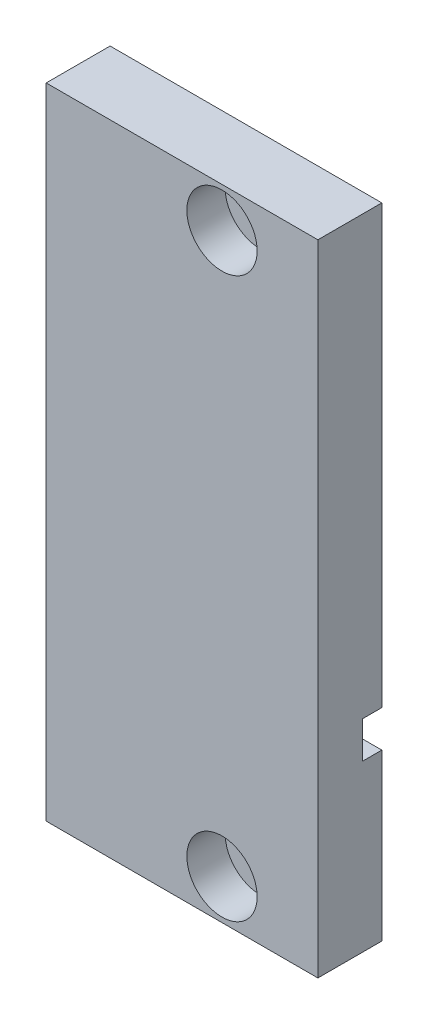
ISO-10303-21;
HEADER;
FILE_DESCRIPTION(('STEP AP214'),'2;1');
FILE_NAME('part.step','',(''),(''),'','','');
FILE_SCHEMA(('AUTOMOTIVE_DESIGN { 1 0 10303 214 1 1 1 1 }'));
ENDSEC;
DATA;
#1=APPLICATION_CONTEXT('core data for automotive mechanical design processes');
#2=APPLICATION_PROTOCOL_DEFINITION('international standard','automotive_design',2000,#1);
#3=PRODUCT_CONTEXT('',#1,'mechanical');
#4=PRODUCT('Part','Part','',(#3));
#5=PRODUCT_RELATED_PRODUCT_CATEGORY('part','',(#4));
#6=PRODUCT_DEFINITION_FORMATION('','',#4);
#7=PRODUCT_DEFINITION_CONTEXT('part definition',#1,'design');
#8=PRODUCT_DEFINITION('design','',#6,#7);
#9=PRODUCT_DEFINITION_SHAPE('','',#8);
#10=(LENGTH_UNIT() NAMED_UNIT(*) SI_UNIT(.MILLI.,.METRE.));
#11=(NAMED_UNIT(*) PLANE_ANGLE_UNIT() SI_UNIT($,.RADIAN.));
#12=(NAMED_UNIT(*) SI_UNIT($,.STERADIAN.) SOLID_ANGLE_UNIT());
#13=UNCERTAINTY_MEASURE_WITH_UNIT(LENGTH_MEASURE(1.E-05),#10,'distance_accuracy_value','');
#14=(GEOMETRIC_REPRESENTATION_CONTEXT(3) GLOBAL_UNCERTAINTY_ASSIGNED_CONTEXT((#13)) GLOBAL_UNIT_ASSIGNED_CONTEXT((#10,
#11,#12)) REPRESENTATION_CONTEXT('',''));
#15=CARTESIAN_POINT('',(0.,0.,0.));
#16=DIRECTION('',(0.,0.,1.));
#17=DIRECTION('',(1.,0.,0.));
#18=AXIS2_PLACEMENT_3D('',#15,#16,#17);
#19=CARTESIAN_POINT('',(-7.,-17.5,4.));
#20=DIRECTION('',(1.,0.,0.));
#21=DIRECTION('',(0.,0.,-1.));
#22=AXIS2_PLACEMENT_3D('',#19,#20,#21);
#23=PLANE('',#22);
#24=DIRECTION('',(0.,-1.,0.));
#25=VECTOR('',#24,1.);
#26=CARTESIAN_POINT('',(-7.,-17.5,0.));
#27=LINE('',#26,#25);
#28=CARTESIAN_POINT('',(-7.,22.5,0.));
#29=VERTEX_POINT('',#28);
#30=CARTESIAN_POINT('',(-7.,-17.5,0.));
#31=VERTEX_POINT('',#30);
#32=EDGE_CURVE('E215',#29,#31,#27,.T.);
#33=ORIENTED_EDGE('',*,*,#32,.T.);
#34=DIRECTION('',(0.,0.,-1.));
#35=VECTOR('',#34,1.);
#36=CARTESIAN_POINT('',(-7.,-17.5,4.));
#37=LINE('',#36,#35);
#38=CARTESIAN_POINT('',(-7.,-17.5,4.));
#39=VERTEX_POINT('',#38);
#40=EDGE_CURVE('E11',#39,#31,#37,.T.);
#41=ORIENTED_EDGE('',*,*,#40,.F.);
#42=DIRECTION('',(0.,-1.,0.));
#43=VECTOR('',#42,1.);
#44=CARTESIAN_POINT('',(-7.,-17.5,4.));
#45=LINE('',#44,#43);
#46=CARTESIAN_POINT('',(-7.,22.5,4.));
#47=VERTEX_POINT('',#46);
#48=EDGE_CURVE('E216',#47,#39,#45,.T.);
#49=ORIENTED_EDGE('',*,*,#48,.F.);
#50=DIRECTION('',(0.,0.,-1.));
#51=VECTOR('',#50,1.);
#52=CARTESIAN_POINT('',(-7.,22.5,4.));
#53=LINE('',#52,#51);
#54=EDGE_CURVE('E226',#47,#29,#53,.T.);
#55=ORIENTED_EDGE('',*,*,#54,.T.);
#56=EDGE_LOOP('',(#33,#41,#49,#55));
#57=FACE_BOUND('',#56,.T.);
#58=ADVANCED_FACE('F39',(#57),#23,.F.);
#59=CARTESIAN_POINT('',(-7.,-17.5,4.));
#60=DIRECTION('',(0.,1.,0.));
#61=DIRECTION('',(0.,0.,1.));
#62=AXIS2_PLACEMENT_3D('',#59,#60,#61);
#63=PLANE('',#62);
#64=DIRECTION('',(1.,0.,0.));
#65=VECTOR('',#64,1.);
#66=CARTESIAN_POINT('',(-7.,-17.5,0.));
#67=LINE('',#66,#65);
#68=CARTESIAN_POINT('',(10.,-17.5,0.));
#69=VERTEX_POINT('',#68);
#70=EDGE_CURVE('E229',#31,#69,#67,.T.);
#71=ORIENTED_EDGE('',*,*,#70,.T.);
#72=DIRECTION('',(0.,0.,-1.));
#73=VECTOR('',#72,1.);
#74=CARTESIAN_POINT('',(10.,-17.5,4.));
#75=LINE('',#74,#73);
#76=CARTESIAN_POINT('',(10.,-17.5,4.));
#77=VERTEX_POINT('',#76);
#78=EDGE_CURVE('E46',#77,#69,#75,.T.);
#79=ORIENTED_EDGE('',*,*,#78,.F.);
#80=DIRECTION('',(1.,0.,0.));
#81=VECTOR('',#80,1.);
#82=CARTESIAN_POINT('',(-7.,-17.5,4.));
#83=LINE('',#82,#81);
#84=EDGE_CURVE('E219',#39,#77,#83,.T.);
#85=ORIENTED_EDGE('',*,*,#84,.F.);
#86=ORIENTED_EDGE('',*,*,#40,.T.);
#87=EDGE_LOOP('',(#71,#79,#85,#86));
#88=FACE_BOUND('',#87,.T.);
#89=ADVANCED_FACE('F275',(#88),#63,.F.);
#90=CARTESIAN_POINT('',(10.,-17.5,4.));
#91=DIRECTION('',(-1.,0.,0.));
#92=DIRECTION('',(0.,-1.,0.));
#93=AXIS2_PLACEMENT_3D('',#90,#91,#92);
#94=PLANE('',#93);
#95=DIRECTION('',(0.,1.,0.));
#96=VECTOR('',#95,1.);
#97=CARTESIAN_POINT('',(10.,-17.5,0.));
#98=LINE('',#97,#96);
#99=CARTESIAN_POINT('',(10.,-7.15000000000001,0.));
#100=VERTEX_POINT('',#99);
#101=EDGE_CURVE('E232',#69,#100,#98,.T.);
#102=ORIENTED_EDGE('',*,*,#101,.T.);
#103=DIRECTION('',(0.,0.,-1.));
#104=VECTOR('',#103,1.);
#105=CARTESIAN_POINT('',(10.,-7.15000000000001,1.2));
#106=LINE('',#105,#104);
#107=CARTESIAN_POINT('',(10.,-7.15000000000001,1.2));
#108=VERTEX_POINT('',#107);
#109=EDGE_CURVE('E172',#108,#100,#106,.T.);
#110=ORIENTED_EDGE('',*,*,#109,.F.);
#111=DIRECTION('',(0.,-1.,0.));
#112=VECTOR('',#111,1.);
#113=CARTESIAN_POINT('',(10.,-4.85,1.2));
#114=LINE('',#113,#112);
#115=CARTESIAN_POINT('',(10.,-4.85,1.2));
#116=VERTEX_POINT('',#115);
#117=EDGE_CURVE('E185',#116,#108,#114,.T.);
#118=ORIENTED_EDGE('',*,*,#117,.F.);
#119=DIRECTION('',(0.,0.,-1.));
#120=VECTOR('',#119,1.);
#121=CARTESIAN_POINT('',(10.,-4.85,1.2));
#122=LINE('',#121,#120);
#123=CARTESIAN_POINT('',(10.,-4.85,0.));
#124=VERTEX_POINT('',#123);
#125=EDGE_CURVE('E169',#116,#124,#122,.T.);
#126=ORIENTED_EDGE('',*,*,#125,.T.);
#127=CARTESIAN_POINT('',(10.,22.5,0.));
#128=VERTEX_POINT('',#127);
#129=EDGE_CURVE('E231',#124,#128,#98,.T.);
#130=ORIENTED_EDGE('',*,*,#129,.T.);
#131=DIRECTION('',(0.,0.,-1.));
#132=VECTOR('',#131,1.);
#133=CARTESIAN_POINT('',(10.,22.5,4.));
#134=LINE('',#133,#132);
#135=CARTESIAN_POINT('',(10.,22.5,4.));
#136=VERTEX_POINT('',#135);
#137=EDGE_CURVE('E238',#136,#128,#134,.T.);
#138=ORIENTED_EDGE('',*,*,#137,.F.);
#139=DIRECTION('',(0.,1.,0.));
#140=VECTOR('',#139,1.);
#141=CARTESIAN_POINT('',(10.,-17.5,4.));
#142=LINE('',#141,#140);
#143=EDGE_CURVE('E222',#77,#136,#142,.T.);
#144=ORIENTED_EDGE('',*,*,#143,.F.);
#145=ORIENTED_EDGE('',*,*,#78,.T.);
#146=EDGE_LOOP('',(#102,#110,#118,#126,#130,#138,#144,#145));
#147=FACE_BOUND('',#146,.T.);
#148=ADVANCED_FACE('F245',(#147),#94,.F.);
#149=CARTESIAN_POINT('',(-7.,22.5,4.));
#150=DIRECTION('',(0.,-1.,0.));
#151=DIRECTION('',(0.,0.,-1.));
#152=AXIS2_PLACEMENT_3D('',#149,#150,#151);
#153=PLANE('',#152);
#154=DIRECTION('',(-1.,0.,0.));
#155=VECTOR('',#154,1.);
#156=CARTESIAN_POINT('',(-7.,22.5,0.));
#157=LINE('',#156,#155);
#158=EDGE_CURVE('E220',#128,#29,#157,.T.);
#159=ORIENTED_EDGE('',*,*,#158,.T.);
#160=ORIENTED_EDGE('',*,*,#54,.F.);
#161=DIRECTION('',(-1.,0.,0.));
#162=VECTOR('',#161,1.);
#163=CARTESIAN_POINT('',(-7.,22.5,4.));
#164=LINE('',#163,#162);
#165=EDGE_CURVE('E224',#136,#47,#164,.T.);
#166=ORIENTED_EDGE('',*,*,#165,.F.);
#167=ORIENTED_EDGE('',*,*,#137,.T.);
#168=EDGE_LOOP('',(#159,#160,#166,#167));
#169=FACE_BOUND('',#168,.T.);
#170=ADVANCED_FACE('F269',(#169),#153,.F.);
#171=CARTESIAN_POINT('',(0.,0.,4.));
#172=DIRECTION('',(0.,0.,-1.));
#173=DIRECTION('',(-1.,0.,0.));
#174=AXIS2_PLACEMENT_3D('',#171,#172,#173);
#175=PLANE('',#174);
#176=CARTESIAN_POINT('',(4.,-15.,4.));
#177=DIRECTION('',(0.,0.,1.));
#178=DIRECTION('',(1.,0.,0.));
#179=AXIS2_PLACEMENT_3D('',#176,#177,#178);
#180=CIRCLE('',#179,2.19999999999999);
#181=CARTESIAN_POINT('',(6.19999999999999,-15.,4.));
#182=VERTEX_POINT('',#181);
#183=EDGE_CURVE('E162',#182,#182,#180,.T.);
#184=ORIENTED_EDGE('',*,*,#183,.F.);
#185=EDGE_LOOP('',(#184));
#186=FACE_BOUND('',#185,.T.);
#187=CARTESIAN_POINT('',(4.,20.,4.));
#188=DIRECTION('',(0.,0.,1.));
#189=DIRECTION('',(1.,0.,0.));
#190=AXIS2_PLACEMENT_3D('',#187,#188,#189);
#191=CIRCLE('',#190,2.19999999999999);
#192=CARTESIAN_POINT('',(6.19999999999999,20.,4.));
#193=VERTEX_POINT('',#192);
#194=EDGE_CURVE('E203',#193,#193,#191,.T.);
#195=ORIENTED_EDGE('',*,*,#194,.F.);
#196=EDGE_LOOP('',(#195));
#197=FACE_BOUND('',#196,.T.);
#198=ORIENTED_EDGE('',*,*,#48,.T.);
#199=ORIENTED_EDGE('',*,*,#84,.T.);
#200=ORIENTED_EDGE('',*,*,#143,.T.);
#201=ORIENTED_EDGE('',*,*,#165,.T.);
#202=EDGE_LOOP('',(#198,#199,#200,#201));
#203=FACE_BOUND('',#202,.T.);
#204=ADVANCED_FACE('F273',(#186,#197,#203),#175,.F.);
#205=CARTESIAN_POINT('',(0.,0.,0.));
#206=DIRECTION('',(0.,0.,-1.));
#207=DIRECTION('',(-1.,0.,0.));
#208=AXIS2_PLACEMENT_3D('',#205,#206,#207);
#209=PLANE('',#208);
#210=DIRECTION('',(0.,1.,0.));
#211=VECTOR('',#210,1.);
#212=CARTESIAN_POINT('',(2.85000000000001,17.5,0.));
#213=LINE('',#212,#211);
#214=CARTESIAN_POINT('',(2.85000000000001,2.5,0.));
#215=VERTEX_POINT('',#214);
#216=CARTESIAN_POINT('',(2.85000000000001,17.5,0.));
#217=VERTEX_POINT('',#216);
#218=EDGE_CURVE('E53',#215,#217,#213,.T.);
#219=ORIENTED_EDGE('',*,*,#218,.F.);
#220=DIRECTION('',(-1.,0.,0.));
#221=VECTOR('',#220,1.);
#222=CARTESIAN_POINT('',(2.85000000000001,2.5,0.));
#223=LINE('',#222,#221);
#224=CARTESIAN_POINT('',(5.15000000000001,2.5,0.));
#225=VERTEX_POINT('',#224);
#226=EDGE_CURVE('E147',#225,#215,#223,.T.);
#227=ORIENTED_EDGE('',*,*,#226,.F.);
#228=DIRECTION('',(0.,-1.,0.));
#229=VECTOR('',#228,1.);
#230=CARTESIAN_POINT('',(5.15000000000001,17.5,0.));
#231=LINE('',#230,#229);
#232=CARTESIAN_POINT('',(5.15000000000001,17.5,0.));
#233=VERTEX_POINT('',#232);
#234=EDGE_CURVE('E150',#233,#225,#231,.T.);
#235=ORIENTED_EDGE('',*,*,#234,.F.);
#236=DIRECTION('',(1.,0.,0.));
#237=VECTOR('',#236,1.);
#238=CARTESIAN_POINT('',(2.85000000000001,17.5,0.));
#239=LINE('',#238,#237);
#240=EDGE_CURVE('E156',#217,#233,#239,.T.);
#241=ORIENTED_EDGE('',*,*,#240,.F.);
#242=EDGE_LOOP('',(#219,#227,#235,#241));
#243=FACE_BOUND('',#242,.T.);
#244=DIRECTION('',(-1.,0.,0.));
#245=VECTOR('',#244,1.);
#246=CARTESIAN_POINT('',(-2.,-7.15,0.));
#247=LINE('',#246,#245);
#248=CARTESIAN_POINT('',(-2.,-7.15,0.));
#249=VERTEX_POINT('',#248);
#250=EDGE_CURVE('E176',#100,#249,#247,.T.);
#251=ORIENTED_EDGE('',*,*,#250,.F.);
#252=ORIENTED_EDGE('',*,*,#101,.F.);
#253=ORIENTED_EDGE('',*,*,#70,.F.);
#254=ORIENTED_EDGE('',*,*,#32,.F.);
#255=ORIENTED_EDGE('',*,*,#158,.F.);
#256=ORIENTED_EDGE('',*,*,#129,.F.);
#257=DIRECTION('',(1.,0.,0.));
#258=VECTOR('',#257,1.);
#259=CARTESIAN_POINT('',(-2.,-4.85,0.));
#260=LINE('',#259,#258);
#261=CARTESIAN_POINT('',(-2.,-4.85,0.));
#262=VERTEX_POINT('',#261);
#263=EDGE_CURVE('E179',#262,#124,#260,.T.);
#264=ORIENTED_EDGE('',*,*,#263,.F.);
#265=DIRECTION('',(0.,1.,0.));
#266=VECTOR('',#265,1.);
#267=CARTESIAN_POINT('',(-2.,-4.85,0.));
#268=LINE('',#267,#266);
#269=EDGE_CURVE('E61',#249,#262,#268,.T.);
#270=ORIENTED_EDGE('',*,*,#269,.F.);
#271=EDGE_LOOP('',(#251,#252,#253,#254,#255,#256,#264,#270));
#272=FACE_BOUND('',#271,.T.);
#273=CARTESIAN_POINT('',(4.,-15.,0.));
#274=DIRECTION('',(0.,0.,-1.));
#275=DIRECTION('',(-1.,0.,0.));
#276=AXIS2_PLACEMENT_3D('',#273,#274,#275);
#277=CIRCLE('',#276,1.2);
#278=CARTESIAN_POINT('',(2.8,-15.,0.));
#279=VERTEX_POINT('',#278);
#280=EDGE_CURVE('E200',#279,#279,#277,.T.);
#281=ORIENTED_EDGE('',*,*,#280,.F.);
#282=EDGE_LOOP('',(#281));
#283=FACE_BOUND('',#282,.T.);
#284=CARTESIAN_POINT('',(4.,20.,0.));
#285=DIRECTION('',(0.,0.,-1.));
#286=DIRECTION('',(-1.,0.,0.));
#287=AXIS2_PLACEMENT_3D('',#284,#285,#286);
#288=CIRCLE('',#287,1.2);
#289=CARTESIAN_POINT('',(2.8,20.,0.));
#290=VERTEX_POINT('',#289);
#291=EDGE_CURVE('E212',#290,#290,#288,.T.);
#292=ORIENTED_EDGE('',*,*,#291,.F.);
#293=EDGE_LOOP('',(#292));
#294=FACE_BOUND('',#293,.T.);
#295=ADVANCED_FACE('F251',(#243,#272,#283,#294),#209,.T.);
#296=CARTESIAN_POINT('',(4.,20.,4.));
#297=DIRECTION('',(0.,0.,1.));
#298=DIRECTION('',(1.,0.,0.));
#299=AXIS2_PLACEMENT_3D('',#296,#297,#298);
#300=CYLINDRICAL_SURFACE('',#299,1.2);
#301=CARTESIAN_POINT('',(4.,20.,1.6));
#302=DIRECTION('',(0.,0.,1.));
#303=DIRECTION('',(1.,0.,0.));
#304=AXIS2_PLACEMENT_3D('',#301,#302,#303);
#305=CIRCLE('',#304,1.2);
#306=CARTESIAN_POINT('',(5.2,20.,1.6));
#307=VERTEX_POINT('',#306);
#308=EDGE_CURVE('E209',#307,#307,#305,.T.);
#309=ORIENTED_EDGE('',*,*,#308,.T.);
#310=EDGE_LOOP('',(#309));
#311=FACE_BOUND('',#310,.T.);
#312=ORIENTED_EDGE('',*,*,#291,.T.);
#313=EDGE_LOOP('',(#312));
#314=FACE_BOUND('',#313,.T.);
#315=ADVANCED_FACE('F290',(#311,#314),#300,.F.);
#316=CARTESIAN_POINT('',(5.2,20.,1.6));
#317=DIRECTION('',(0.,0.,-1.));
#318=DIRECTION('',(-1.,0.,0.));
#319=AXIS2_PLACEMENT_3D('',#316,#317,#318);
#320=PLANE('',#319);
#321=ORIENTED_EDGE('',*,*,#308,.F.);
#322=EDGE_LOOP('',(#321));
#323=FACE_BOUND('',#322,.T.);
#324=CARTESIAN_POINT('',(4.,20.,1.6));
#325=DIRECTION('',(0.,0.,1.));
#326=DIRECTION('',(1.,0.,0.));
#327=AXIS2_PLACEMENT_3D('',#324,#325,#326);
#328=CIRCLE('',#327,2.2);
#329=CARTESIAN_POINT('',(6.2,20.,1.6));
#330=VERTEX_POINT('',#329);
#331=EDGE_CURVE('E206',#330,#330,#328,.T.);
#332=ORIENTED_EDGE('',*,*,#331,.T.);
#333=EDGE_LOOP('',(#332));
#334=FACE_BOUND('',#333,.T.);
#335=ADVANCED_FACE('F297',(#323,#334),#320,.F.);
#336=CARTESIAN_POINT('',(4.,20.,4.));
#337=DIRECTION('',(0.,0.,1.));
#338=DIRECTION('',(1.,0.,0.));
#339=AXIS2_PLACEMENT_3D('',#336,#337,#338);
#340=CYLINDRICAL_SURFACE('',#339,2.19999999999999);
#341=ORIENTED_EDGE('',*,*,#331,.F.);
#342=EDGE_LOOP('',(#341));
#343=FACE_BOUND('',#342,.T.);
#344=ORIENTED_EDGE('',*,*,#194,.T.);
#345=EDGE_LOOP('',(#344));
#346=FACE_BOUND('',#345,.T.);
#347=ADVANCED_FACE('F301',(#343,#346),#340,.F.);
#348=CARTESIAN_POINT('',(4.,-15.,4.));
#349=DIRECTION('',(0.,0.,1.));
#350=DIRECTION('',(1.,0.,0.));
#351=AXIS2_PLACEMENT_3D('',#348,#349,#350);
#352=CYLINDRICAL_SURFACE('',#351,1.2);
#353=CARTESIAN_POINT('',(4.,-15.,1.6));
#354=DIRECTION('',(0.,0.,1.));
#355=DIRECTION('',(1.,0.,0.));
#356=AXIS2_PLACEMENT_3D('',#353,#354,#355);
#357=CIRCLE('',#356,1.2);
#358=CARTESIAN_POINT('',(5.2,-15.,1.6));
#359=VERTEX_POINT('',#358);
#360=EDGE_CURVE('E197',#359,#359,#357,.T.);
#361=ORIENTED_EDGE('',*,*,#360,.T.);
#362=EDGE_LOOP('',(#361));
#363=FACE_BOUND('',#362,.T.);
#364=ORIENTED_EDGE('',*,*,#280,.T.);
#365=EDGE_LOOP('',(#364));
#366=FACE_BOUND('',#365,.T.);
#367=ADVANCED_FACE('F305',(#363,#366),#352,.F.);
#368=CARTESIAN_POINT('',(5.2,-15.,1.6));
#369=DIRECTION('',(0.,0.,-1.));
#370=DIRECTION('',(-1.,0.,0.));
#371=AXIS2_PLACEMENT_3D('',#368,#369,#370);
#372=PLANE('',#371);
#373=ORIENTED_EDGE('',*,*,#360,.F.);
#374=EDGE_LOOP('',(#373));
#375=FACE_BOUND('',#374,.T.);
#376=CARTESIAN_POINT('',(4.,-15.,1.6));
#377=DIRECTION('',(0.,0.,1.));
#378=DIRECTION('',(1.,0.,0.));
#379=AXIS2_PLACEMENT_3D('',#376,#377,#378);
#380=CIRCLE('',#379,2.2);
#381=CARTESIAN_POINT('',(6.2,-15.,1.6));
#382=VERTEX_POINT('',#381);
#383=EDGE_CURVE('E194',#382,#382,#380,.T.);
#384=ORIENTED_EDGE('',*,*,#383,.T.);
#385=EDGE_LOOP('',(#384));
#386=FACE_BOUND('',#385,.T.);
#387=ADVANCED_FACE('F309',(#375,#386),#372,.F.);
#388=CARTESIAN_POINT('',(4.,-15.,4.));
#389=DIRECTION('',(0.,0.,1.));
#390=DIRECTION('',(1.,0.,0.));
#391=AXIS2_PLACEMENT_3D('',#388,#389,#390);
#392=CYLINDRICAL_SURFACE('',#391,2.19999999999999);
#393=ORIENTED_EDGE('',*,*,#383,.F.);
#394=EDGE_LOOP('',(#393));
#395=FACE_BOUND('',#394,.T.);
#396=ORIENTED_EDGE('',*,*,#183,.T.);
#397=EDGE_LOOP('',(#396));
#398=FACE_BOUND('',#397,.T.);
#399=ADVANCED_FACE('F313',(#395,#398),#392,.F.);
#400=CARTESIAN_POINT('',(-2.,-4.85,1.2));
#401=DIRECTION('',(-1.,0.,0.));
#402=DIRECTION('',(0.,0.,1.));
#403=AXIS2_PLACEMENT_3D('',#400,#401,#402);
#404=PLANE('',#403);
#405=ORIENTED_EDGE('',*,*,#269,.T.);
#406=DIRECTION('',(0.,0.,-1.));
#407=VECTOR('',#406,1.);
#408=CARTESIAN_POINT('',(-2.,-4.85,1.2));
#409=LINE('',#408,#407);
#410=CARTESIAN_POINT('',(-2.,-4.85,1.2));
#411=VERTEX_POINT('',#410);
#412=EDGE_CURVE('E166',#411,#262,#409,.T.);
#413=ORIENTED_EDGE('',*,*,#412,.F.);
#414=DIRECTION('',(0.,1.,0.));
#415=VECTOR('',#414,1.);
#416=CARTESIAN_POINT('',(-2.,-4.85,1.2));
#417=LINE('',#416,#415);
#418=CARTESIAN_POINT('',(-2.,-7.15,1.2));
#419=VERTEX_POINT('',#418);
#420=EDGE_CURVE('E180',#419,#411,#417,.T.);
#421=ORIENTED_EDGE('',*,*,#420,.F.);
#422=DIRECTION('',(0.,0.,-1.));
#423=VECTOR('',#422,1.);
#424=CARTESIAN_POINT('',(-2.,-7.15,1.2));
#425=LINE('',#424,#423);
#426=EDGE_CURVE('E174',#419,#249,#425,.T.);
#427=ORIENTED_EDGE('',*,*,#426,.T.);
#428=EDGE_LOOP('',(#405,#413,#421,#427));
#429=FACE_BOUND('',#428,.T.);
#430=ADVANCED_FACE('F317',(#429),#404,.F.);
#431=CARTESIAN_POINT('',(-2.,-7.15,1.2));
#432=DIRECTION('',(0.,-1.,0.));
#433=DIRECTION('',(1.,0.,0.));
#434=AXIS2_PLACEMENT_3D('',#431,#432,#433);
#435=PLANE('',#434);
#436=ORIENTED_EDGE('',*,*,#250,.T.);
#437=ORIENTED_EDGE('',*,*,#426,.F.);
#438=DIRECTION('',(-1.,0.,0.));
#439=VECTOR('',#438,1.);
#440=CARTESIAN_POINT('',(-2.,-7.15,1.2));
#441=LINE('',#440,#439);
#442=EDGE_CURVE('E168',#108,#419,#441,.T.);
#443=ORIENTED_EDGE('',*,*,#442,.F.);
#444=ORIENTED_EDGE('',*,*,#109,.T.);
#445=EDGE_LOOP('',(#436,#437,#443,#444));
#446=FACE_BOUND('',#445,.T.);
#447=ADVANCED_FACE('F256',(#446),#435,.F.);
#448=CARTESIAN_POINT('',(-2.,-4.85,1.2));
#449=DIRECTION('',(0.,1.,0.));
#450=DIRECTION('',(-1.,0.,0.));
#451=AXIS2_PLACEMENT_3D('',#448,#449,#450);
#452=PLANE('',#451);
#453=ORIENTED_EDGE('',*,*,#263,.T.);
#454=ORIENTED_EDGE('',*,*,#125,.F.);
#455=DIRECTION('',(1.,0.,0.));
#456=VECTOR('',#455,1.);
#457=CARTESIAN_POINT('',(-2.,-4.85,1.2));
#458=LINE('',#457,#456);
#459=EDGE_CURVE('E187',#411,#116,#458,.T.);
#460=ORIENTED_EDGE('',*,*,#459,.F.);
#461=ORIENTED_EDGE('',*,*,#412,.T.);
#462=EDGE_LOOP('',(#453,#454,#460,#461));
#463=FACE_BOUND('',#462,.T.);
#464=ADVANCED_FACE('F265',(#463),#452,.F.);
#465=CARTESIAN_POINT('',(0.,0.,1.2));
#466=DIRECTION('',(0.,0.,1.));
#467=DIRECTION('',(1.,0.,0.));
#468=AXIS2_PLACEMENT_3D('',#465,#466,#467);
#469=PLANE('',#468);
#470=ORIENTED_EDGE('',*,*,#420,.T.);
#471=ORIENTED_EDGE('',*,*,#459,.T.);
#472=ORIENTED_EDGE('',*,*,#117,.T.);
#473=ORIENTED_EDGE('',*,*,#442,.T.);
#474=EDGE_LOOP('',(#470,#471,#472,#473));
#475=FACE_BOUND('',#474,.T.);
#476=ADVANCED_FACE('F262',(#475),#469,.F.);
#477=CARTESIAN_POINT('',(2.85000000000001,17.5,1.2));
#478=DIRECTION('',(-1.,0.,0.));
#479=DIRECTION('',(0.,-1.,0.));
#480=AXIS2_PLACEMENT_3D('',#477,#478,#479);
#481=PLANE('',#480);
#482=ORIENTED_EDGE('',*,*,#218,.T.);
#483=DIRECTION('',(0.,0.,-1.));
#484=VECTOR('',#483,1.);
#485=CARTESIAN_POINT('',(2.85000000000001,17.5,1.2));
#486=LINE('',#485,#484);
#487=CARTESIAN_POINT('',(2.85000000000001,17.5,1.2));
#488=VERTEX_POINT('',#487);
#489=EDGE_CURVE('E125',#488,#217,#486,.T.);
#490=ORIENTED_EDGE('',*,*,#489,.F.);
#491=DIRECTION('',(0.,1.,0.));
#492=VECTOR('',#491,1.);
#493=CARTESIAN_POINT('',(2.85000000000001,17.5,1.2));
#494=LINE('',#493,#492);
#495=CARTESIAN_POINT('',(2.85000000000001,2.5,1.2));
#496=VERTEX_POINT('',#495);
#497=EDGE_CURVE('E129',#496,#488,#494,.T.);
#498=ORIENTED_EDGE('',*,*,#497,.F.);
#499=DIRECTION('',(0.,0.,-1.));
#500=VECTOR('',#499,1.);
#501=CARTESIAN_POINT('',(2.85000000000001,2.5,1.2));
#502=LINE('',#501,#500);
#503=EDGE_CURVE('E160',#496,#215,#502,.T.);
#504=ORIENTED_EDGE('',*,*,#503,.T.);
#505=EDGE_LOOP('',(#482,#490,#498,#504));
#506=FACE_BOUND('',#505,.T.);
#507=ADVANCED_FACE('F127',(#506),#481,.F.);
#508=CARTESIAN_POINT('',(2.85000000000001,2.5,1.2));
#509=DIRECTION('',(0.,-1.,0.));
#510=DIRECTION('',(0.,0.,-1.));
#511=AXIS2_PLACEMENT_3D('',#508,#509,#510);
#512=PLANE('',#511);
#513=ORIENTED_EDGE('',*,*,#226,.T.);
#514=ORIENTED_EDGE('',*,*,#503,.F.);
#515=DIRECTION('',(-1.,0.,0.));
#516=VECTOR('',#515,1.);
#517=CARTESIAN_POINT('',(2.85000000000001,2.5,1.2));
#518=LINE('',#517,#516);
#519=CARTESIAN_POINT('',(5.15000000000001,2.5,1.2));
#520=VERTEX_POINT('',#519);
#521=EDGE_CURVE('E135',#520,#496,#518,.T.);
#522=ORIENTED_EDGE('',*,*,#521,.F.);
#523=DIRECTION('',(0.,0.,-1.));
#524=VECTOR('',#523,1.);
#525=CARTESIAN_POINT('',(5.15000000000001,2.5,1.2));
#526=LINE('',#525,#524);
#527=EDGE_CURVE('E163',#520,#225,#526,.T.);
#528=ORIENTED_EDGE('',*,*,#527,.T.);
#529=EDGE_LOOP('',(#513,#514,#522,#528));
#530=FACE_BOUND('',#529,.T.);
#531=ADVANCED_FACE('F329',(#530),#512,.F.);
#532=CARTESIAN_POINT('',(5.15000000000001,17.5,1.2));
#533=DIRECTION('',(1.,0.,0.));
#534=DIRECTION('',(0.,1.,0.));
#535=AXIS2_PLACEMENT_3D('',#532,#533,#534);
#536=PLANE('',#535);
#537=ORIENTED_EDGE('',*,*,#234,.T.);
#538=ORIENTED_EDGE('',*,*,#527,.F.);
#539=DIRECTION('',(0.,-1.,0.));
#540=VECTOR('',#539,1.);
#541=CARTESIAN_POINT('',(5.15000000000001,17.5,1.2));
#542=LINE('',#541,#540);
#543=CARTESIAN_POINT('',(5.15000000000001,17.5,1.2));
#544=VERTEX_POINT('',#543);
#545=EDGE_CURVE('E143',#544,#520,#542,.T.);
#546=ORIENTED_EDGE('',*,*,#545,.F.);
#547=DIRECTION('',(0.,0.,-1.));
#548=VECTOR('',#547,1.);
#549=CARTESIAN_POINT('',(5.15000000000001,17.5,1.2));
#550=LINE('',#549,#548);
#551=EDGE_CURVE('E134',#544,#233,#550,.T.);
#552=ORIENTED_EDGE('',*,*,#551,.T.);
#553=EDGE_LOOP('',(#537,#538,#546,#552));
#554=FACE_BOUND('',#553,.T.);
#555=ADVANCED_FACE('F332',(#554),#536,.F.);
#556=CARTESIAN_POINT('',(2.85000000000001,17.5,1.2));
#557=DIRECTION('',(0.,1.,0.));
#558=DIRECTION('',(0.,0.,1.));
#559=AXIS2_PLACEMENT_3D('',#556,#557,#558);
#560=PLANE('',#559);
#561=ORIENTED_EDGE('',*,*,#240,.T.);
#562=ORIENTED_EDGE('',*,*,#551,.F.);
#563=DIRECTION('',(1.,0.,0.));
#564=VECTOR('',#563,1.);
#565=CARTESIAN_POINT('',(2.85000000000001,17.5,1.2));
#566=LINE('',#565,#564);
#567=EDGE_CURVE('E138',#488,#544,#566,.T.);
#568=ORIENTED_EDGE('',*,*,#567,.F.);
#569=ORIENTED_EDGE('',*,*,#489,.T.);
#570=EDGE_LOOP('',(#561,#562,#568,#569));
#571=FACE_BOUND('',#570,.T.);
#572=ADVANCED_FACE('F139',(#571),#560,.F.);
#573=CARTESIAN_POINT('',(0.,0.,1.2));
#574=DIRECTION('',(0.,0.,1.));
#575=DIRECTION('',(1.,0.,0.));
#576=AXIS2_PLACEMENT_3D('',#573,#574,#575);
#577=PLANE('',#576);
#578=ORIENTED_EDGE('',*,*,#497,.T.);
#579=ORIENTED_EDGE('',*,*,#567,.T.);
#580=ORIENTED_EDGE('',*,*,#545,.T.);
#581=ORIENTED_EDGE('',*,*,#521,.T.);
#582=EDGE_LOOP('',(#578,#579,#580,#581));
#583=FACE_BOUND('',#582,.T.);
#584=ADVANCED_FACE('F145',(#583),#577,.F.);
#585=CLOSED_SHELL('',(#58,#89,#148,#170,#204,#295,#315,#335,#347,#367,#387,#399,#430,#447,#464,
#476,#507,#531,#555,#572,#584));
#586=MANIFOLD_SOLID_BREP('B2',#585);
#587=ADVANCED_BREP_SHAPE_REPRESENTATION('',(#18,#586),#14);
#588=SHAPE_DEFINITION_REPRESENTATION(#9,#587);
ENDSEC;
END-ISO-10303-21;
